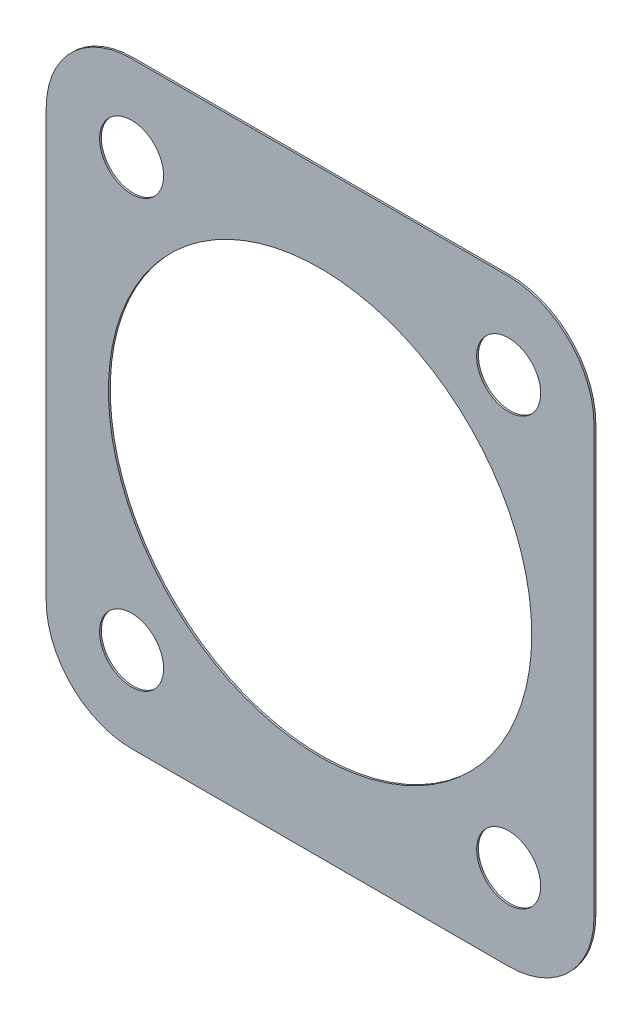
ISO-10303-21;
HEADER;
FILE_DESCRIPTION(('STEP AP214'),'2;1');
FILE_NAME('part.step','',(''),(''),'','','');
FILE_SCHEMA(('AUTOMOTIVE_DESIGN { 1 0 10303 214 1 1 1 1 }'));
ENDSEC;
DATA;
#1=APPLICATION_CONTEXT('core data for automotive mechanical design processes');
#2=APPLICATION_PROTOCOL_DEFINITION('international standard','automotive_design',2000,#1);
#3=PRODUCT_CONTEXT('',#1,'mechanical');
#4=PRODUCT('Part','Part','',(#3));
#5=PRODUCT_RELATED_PRODUCT_CATEGORY('part','',(#4));
#6=PRODUCT_DEFINITION_FORMATION('','',#4);
#7=PRODUCT_DEFINITION_CONTEXT('part definition',#1,'design');
#8=PRODUCT_DEFINITION('design','',#6,#7);
#9=PRODUCT_DEFINITION_SHAPE('','',#8);
#10=(LENGTH_UNIT() NAMED_UNIT(*) SI_UNIT(.MILLI.,.METRE.));
#11=(NAMED_UNIT(*) PLANE_ANGLE_UNIT() SI_UNIT($,.RADIAN.));
#12=(NAMED_UNIT(*) SI_UNIT($,.STERADIAN.) SOLID_ANGLE_UNIT());
#13=UNCERTAINTY_MEASURE_WITH_UNIT(LENGTH_MEASURE(1.E-05),#10,'distance_accuracy_value','');
#14=(GEOMETRIC_REPRESENTATION_CONTEXT(3) GLOBAL_UNCERTAINTY_ASSIGNED_CONTEXT((#13)) GLOBAL_UNIT_ASSIGNED_CONTEXT((#10,
#11,#12)) REPRESENTATION_CONTEXT('',''));
#15=CARTESIAN_POINT('',(0.,0.,0.));
#16=DIRECTION('',(0.,0.,1.));
#17=DIRECTION('',(1.,0.,0.));
#18=AXIS2_PLACEMENT_3D('',#15,#16,#17);
#19=CARTESIAN_POINT('',(53.,-60.,0.5));
#20=DIRECTION('',(0.,0.,-1.));
#21=DIRECTION('',(-1.,0.,0.));
#22=AXIS2_PLACEMENT_3D('',#19,#20,#21);
#23=PLANE('',#22);
#24=CARTESIAN_POINT('',(53.,-60.,0.5));
#25=DIRECTION('',(0.,0.,1.));
#26=DIRECTION('',(-1.,0.,0.));
#27=AXIS2_PLACEMENT_3D('',#24,#25,#26);
#28=CIRCLE('',#27,24.);
#29=CARTESIAN_POINT('',(53.,-84.,0.5));
#30=VERTEX_POINT('',#29);
#31=CARTESIAN_POINT('',(77.,-60.,0.5));
#32=VERTEX_POINT('',#31);
#33=EDGE_CURVE('E152',#30,#32,#28,.T.);
#34=ORIENTED_EDGE('',*,*,#33,.T.);
#35=DIRECTION('',(0.,1.,0.));
#36=VECTOR('',#35,1.);
#37=CARTESIAN_POINT('',(77.,60.,0.5));
#38=LINE('',#37,#36);
#39=CARTESIAN_POINT('',(77.,60.,0.5));
#40=VERTEX_POINT('',#39);
#41=EDGE_CURVE('E100',#32,#40,#38,.T.);
#42=ORIENTED_EDGE('',*,*,#41,.T.);
#43=CARTESIAN_POINT('',(53.,60.,0.5));
#44=DIRECTION('',(0.,0.,1.));
#45=DIRECTION('',(-1.,0.,0.));
#46=AXIS2_PLACEMENT_3D('',#43,#44,#45);
#47=CIRCLE('',#46,24.);
#48=CARTESIAN_POINT('',(53.,84.,0.5));
#49=VERTEX_POINT('',#48);
#50=EDGE_CURVE('E167',#40,#49,#47,.T.);
#51=ORIENTED_EDGE('',*,*,#50,.T.);
#52=DIRECTION('',(-1.,0.,0.));
#53=VECTOR('',#52,1.);
#54=CARTESIAN_POINT('',(-53.,84.,0.5));
#55=LINE('',#54,#53);
#56=CARTESIAN_POINT('',(-53.,84.,0.5));
#57=VERTEX_POINT('',#56);
#58=EDGE_CURVE('E180',#49,#57,#55,.T.);
#59=ORIENTED_EDGE('',*,*,#58,.T.);
#60=CARTESIAN_POINT('',(-53.,60.,0.5));
#61=DIRECTION('',(0.,0.,1.));
#62=DIRECTION('',(-1.,0.,0.));
#63=AXIS2_PLACEMENT_3D('',#60,#61,#62);
#64=CIRCLE('',#63,24.);
#65=CARTESIAN_POINT('',(-77.,60.,0.5));
#66=VERTEX_POINT('',#65);
#67=EDGE_CURVE('E119',#57,#66,#64,.T.);
#68=ORIENTED_EDGE('',*,*,#67,.T.);
#69=DIRECTION('',(0.,-1.,0.));
#70=VECTOR('',#69,1.);
#71=CARTESIAN_POINT('',(-77.,60.,0.5));
#72=LINE('',#71,#70);
#73=CARTESIAN_POINT('',(-77.,-60.,0.5));
#74=VERTEX_POINT('',#73);
#75=EDGE_CURVE('E113',#66,#74,#72,.T.);
#76=ORIENTED_EDGE('',*,*,#75,.T.);
#77=CARTESIAN_POINT('',(-53.,-60.,0.5));
#78=DIRECTION('',(0.,0.,1.));
#79=DIRECTION('',(-1.,0.,0.));
#80=AXIS2_PLACEMENT_3D('',#77,#78,#79);
#81=CIRCLE('',#80,24.);
#82=CARTESIAN_POINT('',(-53.,-84.,0.5));
#83=VERTEX_POINT('',#82);
#84=EDGE_CURVE('E117',#74,#83,#81,.T.);
#85=ORIENTED_EDGE('',*,*,#84,.T.);
#86=DIRECTION('',(1.,0.,0.));
#87=VECTOR('',#86,1.);
#88=CARTESIAN_POINT('',(-53.,-84.,0.5));
#89=LINE('',#88,#87);
#90=EDGE_CURVE('E57',#83,#30,#89,.T.);
#91=ORIENTED_EDGE('',*,*,#90,.T.);
#92=EDGE_LOOP('',(#34,#42,#51,#59,#68,#76,#85,#91));
#93=FACE_BOUND('',#92,.T.);
#94=CARTESIAN_POINT('',(53.,60.,0.5));
#95=DIRECTION('',(0.,0.,1.));
#96=DIRECTION('',(1.,0.,0.));
#97=AXIS2_PLACEMENT_3D('',#94,#95,#96);
#98=CIRCLE('',#97,9.00000000000001);
#99=CARTESIAN_POINT('',(62.,60.,0.5));
#100=VERTEX_POINT('',#99);
#101=EDGE_CURVE('E141',#100,#100,#98,.T.);
#102=ORIENTED_EDGE('',*,*,#101,.F.);
#103=EDGE_LOOP('',(#102));
#104=FACE_BOUND('',#103,.T.);
#105=CARTESIAN_POINT('',(-53.,60.,0.5));
#106=DIRECTION('',(0.,0.,1.));
#107=DIRECTION('',(-1.,0.,0.));
#108=AXIS2_PLACEMENT_3D('',#105,#106,#107);
#109=CIRCLE('',#108,9.00000000000001);
#110=CARTESIAN_POINT('',(-62.,60.,0.5));
#111=VERTEX_POINT('',#110);
#112=EDGE_CURVE('E189',#111,#111,#109,.T.);
#113=ORIENTED_EDGE('',*,*,#112,.F.);
#114=EDGE_LOOP('',(#113));
#115=FACE_BOUND('',#114,.T.);
#116=CARTESIAN_POINT('',(53.,-60.,0.5));
#117=DIRECTION('',(0.,0.,1.));
#118=DIRECTION('',(-1.,0.,0.));
#119=AXIS2_PLACEMENT_3D('',#116,#117,#118);
#120=CIRCLE('',#119,9.);
#121=CARTESIAN_POINT('',(44.,-60.,0.5));
#122=VERTEX_POINT('',#121);
#123=EDGE_CURVE('E195',#122,#122,#120,.T.);
#124=ORIENTED_EDGE('',*,*,#123,.F.);
#125=EDGE_LOOP('',(#124));
#126=FACE_BOUND('',#125,.T.);
#127=CARTESIAN_POINT('',(-53.,-60.,0.5));
#128=DIRECTION('',(0.,0.,1.));
#129=DIRECTION('',(1.,0.,0.));
#130=AXIS2_PLACEMENT_3D('',#127,#128,#129);
#131=CIRCLE('',#130,9.);
#132=CARTESIAN_POINT('',(-44.,-60.,0.5));
#133=VERTEX_POINT('',#132);
#134=EDGE_CURVE('E201',#133,#133,#131,.T.);
#135=ORIENTED_EDGE('',*,*,#134,.F.);
#136=EDGE_LOOP('',(#135));
#137=FACE_BOUND('',#136,.T.);
#138=CARTESIAN_POINT('',(0.,0.,0.5));
#139=DIRECTION('',(0.,0.,1.));
#140=DIRECTION('',(1.,0.,0.));
#141=AXIS2_PLACEMENT_3D('',#138,#139,#140);
#142=CIRCLE('',#141,59.5);
#143=CARTESIAN_POINT('',(59.5,0.,0.5));
#144=VERTEX_POINT('',#143);
#145=EDGE_CURVE('E207',#144,#144,#142,.T.);
#146=ORIENTED_EDGE('',*,*,#145,.F.);
#147=EDGE_LOOP('',(#146));
#148=FACE_BOUND('',#147,.T.);
#149=ADVANCED_FACE('F40',(#93,#104,#115,#126,#137,#148),#23,.F.);
#150=CARTESIAN_POINT('',(53.,-60.,0.));
#151=DIRECTION('',(0.,0.,-1.));
#152=DIRECTION('',(-1.,0.,0.));
#153=AXIS2_PLACEMENT_3D('',#150,#151,#152);
#154=PLANE('',#153);
#155=CARTESIAN_POINT('',(-53.,-60.,0.));
#156=DIRECTION('',(0.,0.,1.));
#157=DIRECTION('',(1.,0.,0.));
#158=AXIS2_PLACEMENT_3D('',#155,#156,#157);
#159=CIRCLE('',#158,9.);
#160=CARTESIAN_POINT('',(-44.,-60.,0.));
#161=VERTEX_POINT('',#160);
#162=EDGE_CURVE('E204',#161,#161,#159,.T.);
#163=ORIENTED_EDGE('',*,*,#162,.T.);
#164=EDGE_LOOP('',(#163));
#165=FACE_BOUND('',#164,.T.);
#166=CARTESIAN_POINT('',(-53.,60.,0.));
#167=DIRECTION('',(0.,0.,1.));
#168=DIRECTION('',(-1.,0.,0.));
#169=AXIS2_PLACEMENT_3D('',#166,#167,#168);
#170=CIRCLE('',#169,9.00000000000001);
#171=CARTESIAN_POINT('',(-62.,60.,0.));
#172=VERTEX_POINT('',#171);
#173=EDGE_CURVE('E192',#172,#172,#170,.T.);
#174=ORIENTED_EDGE('',*,*,#173,.T.);
#175=EDGE_LOOP('',(#174));
#176=FACE_BOUND('',#175,.T.);
#177=CARTESIAN_POINT('',(53.,-60.,0.));
#178=DIRECTION('',(0.,0.,1.));
#179=DIRECTION('',(-1.,0.,0.));
#180=AXIS2_PLACEMENT_3D('',#177,#178,#179);
#181=CIRCLE('',#180,24.);
#182=CARTESIAN_POINT('',(53.,-84.,0.));
#183=VERTEX_POINT('',#182);
#184=CARTESIAN_POINT('',(77.,-60.,0.));
#185=VERTEX_POINT('',#184);
#186=EDGE_CURVE('E137',#183,#185,#181,.T.);
#187=ORIENTED_EDGE('',*,*,#186,.F.);
#188=DIRECTION('',(1.,0.,0.));
#189=VECTOR('',#188,1.);
#190=CARTESIAN_POINT('',(-53.,-84.,0.));
#191=LINE('',#190,#189);
#192=CARTESIAN_POINT('',(-53.,-84.,0.));
#193=VERTEX_POINT('',#192);
#194=EDGE_CURVE('E92',#193,#183,#191,.T.);
#195=ORIENTED_EDGE('',*,*,#194,.F.);
#196=CARTESIAN_POINT('',(-53.,-60.,0.));
#197=DIRECTION('',(0.,0.,1.));
#198=DIRECTION('',(-1.,0.,0.));
#199=AXIS2_PLACEMENT_3D('',#196,#197,#198);
#200=CIRCLE('',#199,24.);
#201=CARTESIAN_POINT('',(-77.,-60.,0.));
#202=VERTEX_POINT('',#201);
#203=EDGE_CURVE('E86',#202,#193,#200,.T.);
#204=ORIENTED_EDGE('',*,*,#203,.F.);
#205=DIRECTION('',(0.,-1.,0.));
#206=VECTOR('',#205,1.);
#207=CARTESIAN_POINT('',(-77.,60.,0.));
#208=LINE('',#207,#206);
#209=CARTESIAN_POINT('',(-77.,60.,0.));
#210=VERTEX_POINT('',#209);
#211=EDGE_CURVE('E127',#210,#202,#208,.T.);
#212=ORIENTED_EDGE('',*,*,#211,.F.);
#213=CARTESIAN_POINT('',(-53.,60.,0.));
#214=DIRECTION('',(0.,0.,1.));
#215=DIRECTION('',(-1.,0.,0.));
#216=AXIS2_PLACEMENT_3D('',#213,#214,#215);
#217=CIRCLE('',#216,24.);
#218=CARTESIAN_POINT('',(-53.,84.,0.));
#219=VERTEX_POINT('',#218);
#220=EDGE_CURVE('E147',#219,#210,#217,.T.);
#221=ORIENTED_EDGE('',*,*,#220,.F.);
#222=DIRECTION('',(-1.,0.,0.));
#223=VECTOR('',#222,1.);
#224=CARTESIAN_POINT('',(-53.,84.,0.));
#225=LINE('',#224,#223);
#226=CARTESIAN_POINT('',(53.,84.,0.));
#227=VERTEX_POINT('',#226);
#228=EDGE_CURVE('E145',#227,#219,#225,.T.);
#229=ORIENTED_EDGE('',*,*,#228,.F.);
#230=CARTESIAN_POINT('',(53.,60.,0.));
#231=DIRECTION('',(0.,0.,1.));
#232=DIRECTION('',(-1.,0.,0.));
#233=AXIS2_PLACEMENT_3D('',#230,#231,#232);
#234=CIRCLE('',#233,24.);
#235=CARTESIAN_POINT('',(77.,60.,0.));
#236=VERTEX_POINT('',#235);
#237=EDGE_CURVE('E143',#236,#227,#234,.T.);
#238=ORIENTED_EDGE('',*,*,#237,.F.);
#239=DIRECTION('',(0.,1.,0.));
#240=VECTOR('',#239,1.);
#241=CARTESIAN_POINT('',(77.,60.,0.));
#242=LINE('',#241,#240);
#243=EDGE_CURVE('E140',#185,#236,#242,.T.);
#244=ORIENTED_EDGE('',*,*,#243,.F.);
#245=EDGE_LOOP('',(#187,#195,#204,#212,#221,#229,#238,#244));
#246=FACE_BOUND('',#245,.T.);
#247=CARTESIAN_POINT('',(53.,60.,0.));
#248=DIRECTION('',(0.,0.,1.));
#249=DIRECTION('',(1.,0.,0.));
#250=AXIS2_PLACEMENT_3D('',#247,#248,#249);
#251=CIRCLE('',#250,9.00000000000001);
#252=CARTESIAN_POINT('',(62.,60.,0.));
#253=VERTEX_POINT('',#252);
#254=EDGE_CURVE('E186',#253,#253,#251,.T.);
#255=ORIENTED_EDGE('',*,*,#254,.T.);
#256=EDGE_LOOP('',(#255));
#257=FACE_BOUND('',#256,.T.);
#258=CARTESIAN_POINT('',(53.,-60.,0.));
#259=DIRECTION('',(0.,0.,1.));
#260=DIRECTION('',(-1.,0.,0.));
#261=AXIS2_PLACEMENT_3D('',#258,#259,#260);
#262=CIRCLE('',#261,9.);
#263=CARTESIAN_POINT('',(44.,-60.,0.));
#264=VERTEX_POINT('',#263);
#265=EDGE_CURVE('E198',#264,#264,#262,.T.);
#266=ORIENTED_EDGE('',*,*,#265,.T.);
#267=EDGE_LOOP('',(#266));
#268=FACE_BOUND('',#267,.T.);
#269=CARTESIAN_POINT('',(0.,0.,0.));
#270=DIRECTION('',(0.,0.,1.));
#271=DIRECTION('',(1.,0.,0.));
#272=AXIS2_PLACEMENT_3D('',#269,#270,#271);
#273=CIRCLE('',#272,59.5);
#274=CARTESIAN_POINT('',(59.5,0.,0.));
#275=VERTEX_POINT('',#274);
#276=EDGE_CURVE('E210',#275,#275,#273,.T.);
#277=ORIENTED_EDGE('',*,*,#276,.T.);
#278=EDGE_LOOP('',(#277));
#279=FACE_BOUND('',#278,.T.);
#280=ADVANCED_FACE('F171',(#165,#176,#246,#257,#268,#279),#154,.T.);
#281=CARTESIAN_POINT('',(53.,-60.,0.5));
#282=DIRECTION('',(0.,0.,-1.));
#283=DIRECTION('',(-1.,0.,0.));
#284=AXIS2_PLACEMENT_3D('',#281,#282,#283);
#285=CYLINDRICAL_SURFACE('',#284,24.);
#286=ORIENTED_EDGE('',*,*,#186,.T.);
#287=DIRECTION('',(0.,0.,-1.));
#288=VECTOR('',#287,1.);
#289=CARTESIAN_POINT('',(77.,-60.,0.5));
#290=LINE('',#289,#288);
#291=EDGE_CURVE('E11',#32,#185,#290,.T.);
#292=ORIENTED_EDGE('',*,*,#291,.F.);
#293=ORIENTED_EDGE('',*,*,#33,.F.);
#294=DIRECTION('',(0.,0.,-1.));
#295=VECTOR('',#294,1.);
#296=CARTESIAN_POINT('',(53.,-84.,0.5));
#297=LINE('',#296,#295);
#298=EDGE_CURVE('E133',#30,#183,#297,.T.);
#299=ORIENTED_EDGE('',*,*,#298,.T.);
#300=EDGE_LOOP('',(#286,#292,#293,#299));
#301=FACE_BOUND('',#300,.T.);
#302=ADVANCED_FACE('F42',(#301),#285,.T.);
#303=CARTESIAN_POINT('',(77.,60.,0.5));
#304=DIRECTION('',(-1.,0.,0.));
#305=DIRECTION('',(0.,0.,1.));
#306=AXIS2_PLACEMENT_3D('',#303,#304,#305);
#307=PLANE('',#306);
#308=ORIENTED_EDGE('',*,*,#243,.T.);
#309=DIRECTION('',(0.,0.,-1.));
#310=VECTOR('',#309,1.);
#311=CARTESIAN_POINT('',(77.,60.,0.5));
#312=LINE('',#311,#310);
#313=EDGE_CURVE('E49',#40,#236,#312,.T.);
#314=ORIENTED_EDGE('',*,*,#313,.F.);
#315=ORIENTED_EDGE('',*,*,#41,.F.);
#316=ORIENTED_EDGE('',*,*,#291,.T.);
#317=EDGE_LOOP('',(#308,#314,#315,#316));
#318=FACE_BOUND('',#317,.T.);
#319=ADVANCED_FACE('F242',(#318),#307,.F.);
#320=CARTESIAN_POINT('',(53.,60.,0.5));
#321=DIRECTION('',(0.,0.,-1.));
#322=DIRECTION('',(-1.,0.,0.));
#323=AXIS2_PLACEMENT_3D('',#320,#321,#322);
#324=CYLINDRICAL_SURFACE('',#323,24.);
#325=ORIENTED_EDGE('',*,*,#237,.T.);
#326=DIRECTION('',(0.,0.,-1.));
#327=VECTOR('',#326,1.);
#328=CARTESIAN_POINT('',(53.,84.,0.5));
#329=LINE('',#328,#327);
#330=EDGE_CURVE('E159',#49,#227,#329,.T.);
#331=ORIENTED_EDGE('',*,*,#330,.F.);
#332=ORIENTED_EDGE('',*,*,#50,.F.);
#333=ORIENTED_EDGE('',*,*,#313,.T.);
#334=EDGE_LOOP('',(#325,#331,#332,#333));
#335=FACE_BOUND('',#334,.T.);
#336=ADVANCED_FACE('F165',(#335),#324,.T.);
#337=CARTESIAN_POINT('',(-53.,84.,0.5));
#338=DIRECTION('',(0.,-1.,0.));
#339=DIRECTION('',(0.,0.,-1.));
#340=AXIS2_PLACEMENT_3D('',#337,#338,#339);
#341=PLANE('',#340);
#342=ORIENTED_EDGE('',*,*,#228,.T.);
#343=DIRECTION('',(0.,0.,-1.));
#344=VECTOR('',#343,1.);
#345=CARTESIAN_POINT('',(-53.,84.,0.5));
#346=LINE('',#345,#344);
#347=EDGE_CURVE('E156',#57,#219,#346,.T.);
#348=ORIENTED_EDGE('',*,*,#347,.F.);
#349=ORIENTED_EDGE('',*,*,#58,.F.);
#350=ORIENTED_EDGE('',*,*,#330,.T.);
#351=EDGE_LOOP('',(#342,#348,#349,#350));
#352=FACE_BOUND('',#351,.T.);
#353=ADVANCED_FACE('F176',(#352),#341,.F.);
#354=CARTESIAN_POINT('',(-53.,60.,0.5));
#355=DIRECTION('',(0.,0.,-1.));
#356=DIRECTION('',(-1.,0.,0.));
#357=AXIS2_PLACEMENT_3D('',#354,#355,#356);
#358=CYLINDRICAL_SURFACE('',#357,24.);
#359=ORIENTED_EDGE('',*,*,#220,.T.);
#360=DIRECTION('',(0.,0.,-1.));
#361=VECTOR('',#360,1.);
#362=CARTESIAN_POINT('',(-77.,60.,0.5));
#363=LINE('',#362,#361);
#364=EDGE_CURVE('E128',#66,#210,#363,.T.);
#365=ORIENTED_EDGE('',*,*,#364,.F.);
#366=ORIENTED_EDGE('',*,*,#67,.F.);
#367=ORIENTED_EDGE('',*,*,#347,.T.);
#368=EDGE_LOOP('',(#359,#365,#366,#367));
#369=FACE_BOUND('',#368,.T.);
#370=ADVANCED_FACE('F179',(#369),#358,.T.);
#371=CARTESIAN_POINT('',(-77.,60.,0.5));
#372=DIRECTION('',(1.,0.,0.));
#373=DIRECTION('',(0.,0.,-1.));
#374=AXIS2_PLACEMENT_3D('',#371,#372,#373);
#375=PLANE('',#374);
#376=ORIENTED_EDGE('',*,*,#211,.T.);
#377=DIRECTION('',(0.,0.,-1.));
#378=VECTOR('',#377,1.);
#379=CARTESIAN_POINT('',(-77.,-60.,0.5));
#380=LINE('',#379,#378);
#381=EDGE_CURVE('E124',#74,#202,#380,.T.);
#382=ORIENTED_EDGE('',*,*,#381,.F.);
#383=ORIENTED_EDGE('',*,*,#75,.F.);
#384=ORIENTED_EDGE('',*,*,#364,.T.);
#385=EDGE_LOOP('',(#376,#382,#383,#384));
#386=FACE_BOUND('',#385,.T.);
#387=ADVANCED_FACE('F125',(#386),#375,.F.);
#388=CARTESIAN_POINT('',(-53.,-60.,0.5));
#389=DIRECTION('',(0.,0.,-1.));
#390=DIRECTION('',(-1.,0.,0.));
#391=AXIS2_PLACEMENT_3D('',#388,#389,#390);
#392=CYLINDRICAL_SURFACE('',#391,24.);
#393=ORIENTED_EDGE('',*,*,#203,.T.);
#394=DIRECTION('',(0.,0.,-1.));
#395=VECTOR('',#394,1.);
#396=CARTESIAN_POINT('',(-53.,-84.,0.5));
#397=LINE('',#396,#395);
#398=EDGE_CURVE('E129',#83,#193,#397,.T.);
#399=ORIENTED_EDGE('',*,*,#398,.F.);
#400=ORIENTED_EDGE('',*,*,#84,.F.);
#401=ORIENTED_EDGE('',*,*,#381,.T.);
#402=EDGE_LOOP('',(#393,#399,#400,#401));
#403=FACE_BOUND('',#402,.T.);
#404=ADVANCED_FACE('F131',(#403),#392,.T.);
#405=CARTESIAN_POINT('',(-53.,-84.,0.5));
#406=DIRECTION('',(0.,1.,0.));
#407=DIRECTION('',(0.,0.,1.));
#408=AXIS2_PLACEMENT_3D('',#405,#406,#407);
#409=PLANE('',#408);
#410=ORIENTED_EDGE('',*,*,#194,.T.);
#411=ORIENTED_EDGE('',*,*,#298,.F.);
#412=ORIENTED_EDGE('',*,*,#90,.F.);
#413=ORIENTED_EDGE('',*,*,#398,.T.);
#414=EDGE_LOOP('',(#410,#411,#412,#413));
#415=FACE_BOUND('',#414,.T.);
#416=ADVANCED_FACE('F230',(#415),#409,.F.);
#417=CARTESIAN_POINT('',(53.,60.,0.5));
#418=DIRECTION('',(0.,0.,-1.));
#419=DIRECTION('',(-1.,0.,0.));
#420=AXIS2_PLACEMENT_3D('',#417,#418,#419);
#421=CYLINDRICAL_SURFACE('',#420,9.00000000000001);
#422=ORIENTED_EDGE('',*,*,#101,.T.);
#423=EDGE_LOOP('',(#422));
#424=FACE_BOUND('',#423,.T.);
#425=ORIENTED_EDGE('',*,*,#254,.F.);
#426=EDGE_LOOP('',(#425));
#427=FACE_BOUND('',#426,.T.);
#428=ADVANCED_FACE('F227',(#424,#427),#421,.F.);
#429=CARTESIAN_POINT('',(-53.,60.,0.5));
#430=DIRECTION('',(0.,0.,-1.));
#431=DIRECTION('',(-1.,0.,0.));
#432=AXIS2_PLACEMENT_3D('',#429,#430,#431);
#433=CYLINDRICAL_SURFACE('',#432,9.00000000000001);
#434=ORIENTED_EDGE('',*,*,#112,.T.);
#435=EDGE_LOOP('',(#434));
#436=FACE_BOUND('',#435,.T.);
#437=ORIENTED_EDGE('',*,*,#173,.F.);
#438=EDGE_LOOP('',(#437));
#439=FACE_BOUND('',#438,.T.);
#440=ADVANCED_FACE('F305',(#436,#439),#433,.F.);
#441=CARTESIAN_POINT('',(53.,-60.,0.5));
#442=DIRECTION('',(0.,0.,-1.));
#443=DIRECTION('',(-1.,0.,0.));
#444=AXIS2_PLACEMENT_3D('',#441,#442,#443);
#445=CYLINDRICAL_SURFACE('',#444,9.);
#446=ORIENTED_EDGE('',*,*,#123,.T.);
#447=EDGE_LOOP('',(#446));
#448=FACE_BOUND('',#447,.T.);
#449=ORIENTED_EDGE('',*,*,#265,.F.);
#450=EDGE_LOOP('',(#449));
#451=FACE_BOUND('',#450,.T.);
#452=ADVANCED_FACE('F313',(#448,#451),#445,.F.);
#453=CARTESIAN_POINT('',(-53.,-60.,0.5));
#454=DIRECTION('',(0.,0.,-1.));
#455=DIRECTION('',(-1.,0.,0.));
#456=AXIS2_PLACEMENT_3D('',#453,#454,#455);
#457=CYLINDRICAL_SURFACE('',#456,9.);
#458=ORIENTED_EDGE('',*,*,#134,.T.);
#459=EDGE_LOOP('',(#458));
#460=FACE_BOUND('',#459,.T.);
#461=ORIENTED_EDGE('',*,*,#162,.F.);
#462=EDGE_LOOP('',(#461));
#463=FACE_BOUND('',#462,.T.);
#464=ADVANCED_FACE('F321',(#460,#463),#457,.F.);
#465=CARTESIAN_POINT('',(0.,0.,0.5));
#466=DIRECTION('',(0.,0.,-1.));
#467=DIRECTION('',(-1.,0.,0.));
#468=AXIS2_PLACEMENT_3D('',#465,#466,#467);
#469=CYLINDRICAL_SURFACE('',#468,59.5);
#470=ORIENTED_EDGE('',*,*,#145,.T.);
#471=EDGE_LOOP('',(#470));
#472=FACE_BOUND('',#471,.T.);
#473=ORIENTED_EDGE('',*,*,#276,.F.);
#474=EDGE_LOOP('',(#473));
#475=FACE_BOUND('',#474,.T.);
#476=ADVANCED_FACE('F216',(#472,#475),#469,.F.);
#477=CLOSED_SHELL('',(#149,#280,#302,#319,#336,#353,#370,#387,#404,#416,#428,#440,#452,#464,#476));
#478=MANIFOLD_SOLID_BREP('B2',#477);
#479=ADVANCED_BREP_SHAPE_REPRESENTATION('',(#18,#478),#14);
#480=SHAPE_DEFINITION_REPRESENTATION(#9,#479);
ENDSEC;
END-ISO-10303-21;
